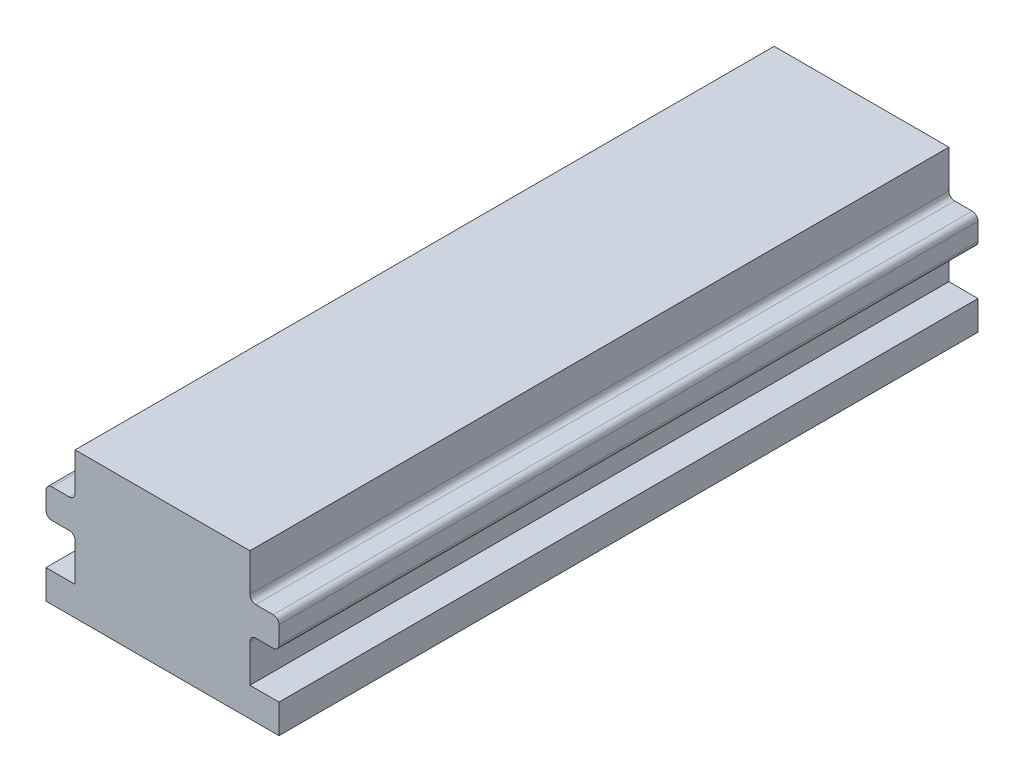
ISO-10303-21;
HEADER;
FILE_DESCRIPTION(('STEP AP214'),'2;1');
FILE_NAME('part.step','',(''),(''),'','','');
FILE_SCHEMA(('AUTOMOTIVE_DESIGN { 1 0 10303 214 1 1 1 1 }'));
ENDSEC;
DATA;
#1=APPLICATION_CONTEXT('core data for automotive mechanical design processes');
#2=APPLICATION_PROTOCOL_DEFINITION('international standard','automotive_design',2000,#1);
#3=PRODUCT_CONTEXT('',#1,'mechanical');
#4=PRODUCT('Part','Part','',(#3));
#5=PRODUCT_RELATED_PRODUCT_CATEGORY('part','',(#4));
#6=PRODUCT_DEFINITION_FORMATION('','',#4);
#7=PRODUCT_DEFINITION_CONTEXT('part definition',#1,'design');
#8=PRODUCT_DEFINITION('design','',#6,#7);
#9=PRODUCT_DEFINITION_SHAPE('','',#8);
#10=(LENGTH_UNIT() NAMED_UNIT(*) SI_UNIT(.MILLI.,.METRE.));
#11=(NAMED_UNIT(*) PLANE_ANGLE_UNIT() SI_UNIT($,.RADIAN.));
#12=(NAMED_UNIT(*) SI_UNIT($,.STERADIAN.) SOLID_ANGLE_UNIT());
#13=UNCERTAINTY_MEASURE_WITH_UNIT(LENGTH_MEASURE(1.E-05),#10,'distance_accuracy_value','');
#14=(GEOMETRIC_REPRESENTATION_CONTEXT(3) GLOBAL_UNCERTAINTY_ASSIGNED_CONTEXT((#13)) GLOBAL_UNIT_ASSIGNED_CONTEXT((#10,
#11,#12)) REPRESENTATION_CONTEXT('',''));
#15=CARTESIAN_POINT('',(0.,0.,0.));
#16=DIRECTION('',(0.,0.,1.));
#17=DIRECTION('',(1.,0.,0.));
#18=AXIS2_PLACEMENT_3D('',#15,#16,#17);
#19=CARTESIAN_POINT('',(0.,0.,152.4));
#20=DIRECTION('',(1.,0.,0.));
#21=DIRECTION('',(0.,0.,-1.));
#22=AXIS2_PLACEMENT_3D('',#19,#20,#21);
#23=PLANE('',#22);
#24=DIRECTION('',(0.,-1.,0.));
#25=VECTOR('',#24,1.);
#26=CARTESIAN_POINT('',(0.,0.,152.4));
#27=LINE('',#26,#25);
#28=CARTESIAN_POINT('',(0.,20.955,152.4));
#29=VERTEX_POINT('',#28);
#30=CARTESIAN_POINT('',(0.,17.145,152.4));
#31=VERTEX_POINT('',#30);
#32=EDGE_CURVE('E362',#29,#31,#27,.T.);
#33=ORIENTED_EDGE('',*,*,#32,.F.);
#34=DIRECTION('',(0.,0.,1.));
#35=VECTOR('',#34,1.);
#36=CARTESIAN_POINT('',(0.,20.955,0.));
#37=LINE('',#36,#35);
#38=CARTESIAN_POINT('',(0.,20.955,0.));
#39=VERTEX_POINT('',#38);
#40=EDGE_CURVE('E260',#39,#29,#37,.T.);
#41=ORIENTED_EDGE('',*,*,#40,.F.);
#42=DIRECTION('',(0.,-1.,0.));
#43=VECTOR('',#42,1.);
#44=CARTESIAN_POINT('',(0.,0.,0.));
#45=LINE('',#44,#43);
#46=CARTESIAN_POINT('',(0.,17.145,0.));
#47=VERTEX_POINT('',#46);
#48=EDGE_CURVE('E350',#39,#47,#45,.T.);
#49=ORIENTED_EDGE('',*,*,#48,.T.);
#50=DIRECTION('',(0.,0.,1.));
#51=VECTOR('',#50,1.);
#52=CARTESIAN_POINT('',(0.,17.145,0.));
#53=LINE('',#52,#51);
#54=EDGE_CURVE('E262',#47,#31,#53,.T.);
#55=ORIENTED_EDGE('',*,*,#54,.T.);
#56=EDGE_LOOP('',(#33,#41,#49,#55));
#57=FACE_BOUND('',#56,.T.);
#58=ADVANCED_FACE('F34',(#57),#23,.F.);
#59=CARTESIAN_POINT('',(50.8,0.,152.4));
#60=DIRECTION('',(-1.,0.,0.));
#61=DIRECTION('',(0.,0.,1.));
#62=AXIS2_PLACEMENT_3D('',#59,#60,#61);
#63=PLANE('',#62);
#64=DIRECTION('',(0.,1.,0.));
#65=VECTOR('',#64,1.);
#66=CARTESIAN_POINT('',(50.8,0.,0.));
#67=LINE('',#66,#65);
#68=CARTESIAN_POINT('',(50.8,0.,0.));
#69=VERTEX_POINT('',#68);
#70=CARTESIAN_POINT('',(50.8,6.35,0.));
#71=VERTEX_POINT('',#70);
#72=EDGE_CURVE('E354',#69,#71,#67,.T.);
#73=ORIENTED_EDGE('',*,*,#72,.T.);
#74=DIRECTION('',(0.,0.,1.));
#75=VECTOR('',#74,1.);
#76=CARTESIAN_POINT('',(50.8,6.35,152.4));
#77=LINE('',#76,#75);
#78=CARTESIAN_POINT('',(50.8,6.35,152.4));
#79=VERTEX_POINT('',#78);
#80=EDGE_CURVE('E345',#71,#79,#77,.T.);
#81=ORIENTED_EDGE('',*,*,#80,.T.);
#82=DIRECTION('',(0.,1.,0.));
#83=VECTOR('',#82,1.);
#84=CARTESIAN_POINT('',(50.8,0.,152.4));
#85=LINE('',#84,#83);
#86=CARTESIAN_POINT('',(50.8,0.,152.4));
#87=VERTEX_POINT('',#86);
#88=EDGE_CURVE('E366',#87,#79,#85,.T.);
#89=ORIENTED_EDGE('',*,*,#88,.F.);
#90=DIRECTION('',(0.,0.,-1.));
#91=VECTOR('',#90,1.);
#92=CARTESIAN_POINT('',(50.8,0.,152.4));
#93=LINE('',#92,#91);
#94=EDGE_CURVE('E371',#87,#69,#93,.T.);
#95=ORIENTED_EDGE('',*,*,#94,.T.);
#96=EDGE_LOOP('',(#73,#81,#89,#95));
#97=FACE_BOUND('',#96,.T.);
#98=ADVANCED_FACE('F431',(#97),#63,.F.);
#99=CARTESIAN_POINT('',(50.8,17.145,152.4));
#100=VERTEX_POINT('',#99);
#101=CARTESIAN_POINT('',(50.8,20.955,152.4));
#102=VERTEX_POINT('',#101);
#103=EDGE_CURVE('E365',#100,#102,#85,.T.);
#104=ORIENTED_EDGE('',*,*,#103,.F.);
#105=DIRECTION('',(0.,0.,1.));
#106=VECTOR('',#105,1.);
#107=CARTESIAN_POINT('',(50.8,17.145,0.));
#108=LINE('',#107,#106);
#109=CARTESIAN_POINT('',(50.8,17.145,0.));
#110=VERTEX_POINT('',#109);
#111=EDGE_CURVE('E332',#110,#100,#108,.T.);
#112=ORIENTED_EDGE('',*,*,#111,.F.);
#113=CARTESIAN_POINT('',(50.8,20.955,0.));
#114=VERTEX_POINT('',#113);
#115=EDGE_CURVE('E353',#110,#114,#67,.T.);
#116=ORIENTED_EDGE('',*,*,#115,.T.);
#117=DIRECTION('',(0.,0.,1.));
#118=VECTOR('',#117,1.);
#119=CARTESIAN_POINT('',(50.8,20.955,0.));
#120=LINE('',#119,#118);
#121=EDGE_CURVE('E334',#114,#102,#120,.T.);
#122=ORIENTED_EDGE('',*,*,#121,.T.);
#123=EDGE_LOOP('',(#104,#112,#116,#122));
#124=FACE_BOUND('',#123,.T.);
#125=ADVANCED_FACE('F409',(#124),#63,.F.);
#126=CARTESIAN_POINT('',(0.,6.35000000000004,152.4));
#127=VERTEX_POINT('',#126);
#128=CARTESIAN_POINT('',(0.,0.,152.4));
#129=VERTEX_POINT('',#128);
#130=EDGE_CURVE('E360',#127,#129,#27,.T.);
#131=ORIENTED_EDGE('',*,*,#130,.F.);
#132=DIRECTION('',(0.,0.,-1.));
#133=VECTOR('',#132,1.);
#134=CARTESIAN_POINT('',(0.,6.35000000000004,152.4));
#135=LINE('',#134,#133);
#136=CARTESIAN_POINT('',(0.,6.35000000000004,0.));
#137=VERTEX_POINT('',#136);
#138=EDGE_CURVE('E199',#127,#137,#135,.T.);
#139=ORIENTED_EDGE('',*,*,#138,.T.);
#140=CARTESIAN_POINT('',(0.,0.,0.));
#141=VERTEX_POINT('',#140);
#142=EDGE_CURVE('E348',#137,#141,#45,.T.);
#143=ORIENTED_EDGE('',*,*,#142,.T.);
#144=DIRECTION('',(0.,0.,-1.));
#145=VECTOR('',#144,1.);
#146=CARTESIAN_POINT('',(0.,0.,152.4));
#147=LINE('',#146,#145);
#148=EDGE_CURVE('E374',#129,#141,#147,.T.);
#149=ORIENTED_EDGE('',*,*,#148,.F.);
#150=EDGE_LOOP('',(#131,#139,#143,#149));
#151=FACE_BOUND('',#150,.T.);
#152=ADVANCED_FACE('F36',(#151),#23,.F.);
#153=CARTESIAN_POINT('',(0.,0.,152.4));
#154=DIRECTION('',(0.,1.,0.));
#155=DIRECTION('',(0.,0.,1.));
#156=AXIS2_PLACEMENT_3D('',#153,#154,#155);
#157=PLANE('',#156);
#158=DIRECTION('',(1.,0.,0.));
#159=VECTOR('',#158,1.);
#160=CARTESIAN_POINT('',(0.,0.,0.));
#161=LINE('',#160,#159);
#162=EDGE_CURVE('E351',#141,#69,#161,.T.);
#163=ORIENTED_EDGE('',*,*,#162,.T.);
#164=ORIENTED_EDGE('',*,*,#94,.F.);
#165=DIRECTION('',(1.,0.,0.));
#166=VECTOR('',#165,1.);
#167=CARTESIAN_POINT('',(0.,0.,152.4));
#168=LINE('',#167,#166);
#169=EDGE_CURVE('E363',#129,#87,#168,.T.);
#170=ORIENTED_EDGE('',*,*,#169,.F.);
#171=ORIENTED_EDGE('',*,*,#148,.T.);
#172=EDGE_LOOP('',(#163,#164,#170,#171));
#173=FACE_BOUND('',#172,.T.);
#174=ADVANCED_FACE('F436',(#173),#157,.F.);
#175=CARTESIAN_POINT('',(0.,31.75,152.4));
#176=DIRECTION('',(0.,-1.,0.));
#177=DIRECTION('',(0.,0.,-1.));
#178=AXIS2_PLACEMENT_3D('',#175,#176,#177);
#179=PLANE('',#178);
#180=DIRECTION('',(-1.,0.,0.));
#181=VECTOR('',#180,1.);
#182=CARTESIAN_POINT('',(0.,31.75,0.));
#183=LINE('',#182,#181);
#184=CARTESIAN_POINT('',(44.45,31.75,0.));
#185=VERTEX_POINT('',#184);
#186=CARTESIAN_POINT('',(6.35,31.75,0.));
#187=VERTEX_POINT('',#186);
#188=EDGE_CURVE('E357',#185,#187,#183,.T.);
#189=ORIENTED_EDGE('',*,*,#188,.T.);
#190=DIRECTION('',(0.,0.,1.));
#191=VECTOR('',#190,1.);
#192=CARTESIAN_POINT('',(6.35,31.75,152.4));
#193=LINE('',#192,#191);
#194=CARTESIAN_POINT('',(6.35,31.75,152.4));
#195=VERTEX_POINT('',#194);
#196=EDGE_CURVE('E271',#187,#195,#193,.T.);
#197=ORIENTED_EDGE('',*,*,#196,.T.);
#198=DIRECTION('',(-1.,0.,0.));
#199=VECTOR('',#198,1.);
#200=CARTESIAN_POINT('',(0.,31.75,152.4));
#201=LINE('',#200,#199);
#202=CARTESIAN_POINT('',(44.45,31.75,152.4));
#203=VERTEX_POINT('',#202);
#204=EDGE_CURVE('E369',#203,#195,#201,.T.);
#205=ORIENTED_EDGE('',*,*,#204,.F.);
#206=DIRECTION('',(0.,0.,-1.));
#207=VECTOR('',#206,1.);
#208=CARTESIAN_POINT('',(44.45,31.75,152.4));
#209=LINE('',#208,#207);
#210=EDGE_CURVE('E325',#203,#185,#209,.T.);
#211=ORIENTED_EDGE('',*,*,#210,.T.);
#212=EDGE_LOOP('',(#189,#197,#205,#211));
#213=FACE_BOUND('',#212,.T.);
#214=ADVANCED_FACE('F385',(#213),#179,.F.);
#215=CARTESIAN_POINT('',(0.,31.75,152.4));
#216=DIRECTION('',(0.,0.,-1.));
#217=DIRECTION('',(-1.,0.,0.));
#218=AXIS2_PLACEMENT_3D('',#215,#216,#217);
#219=PLANE('',#218);
#220=ORIENTED_EDGE('',*,*,#204,.T.);
#221=DIRECTION('',(0.,1.,0.));
#222=VECTOR('',#221,1.);
#223=CARTESIAN_POINT('',(6.35,38.1,152.4));
#224=LINE('',#223,#222);
#225=CARTESIAN_POINT('',(6.35,23.495,152.4));
#226=VERTEX_POINT('',#225);
#227=EDGE_CURVE('E233',#226,#195,#224,.T.);
#228=ORIENTED_EDGE('',*,*,#227,.F.);
#229=CARTESIAN_POINT('',(5.08,23.495,152.4));
#230=DIRECTION('',(0.,0.,1.));
#231=DIRECTION('',(-1.,0.,0.));
#232=AXIS2_PLACEMENT_3D('',#229,#230,#231);
#233=CIRCLE('',#232,1.27);
#234=CARTESIAN_POINT('',(5.07999999999999,22.225,152.4));
#235=VERTEX_POINT('',#234);
#236=EDGE_CURVE('E230',#235,#226,#233,.T.);
#237=ORIENTED_EDGE('',*,*,#236,.F.);
#238=DIRECTION('',(1.,0.,0.));
#239=VECTOR('',#238,1.);
#240=CARTESIAN_POINT('',(5.07999999999999,22.225,152.4));
#241=LINE('',#240,#239);
#242=CARTESIAN_POINT('',(1.27000000000001,22.225,152.4));
#243=VERTEX_POINT('',#242);
#244=EDGE_CURVE('E227',#243,#235,#241,.T.);
#245=ORIENTED_EDGE('',*,*,#244,.F.);
#246=CARTESIAN_POINT('',(1.27,20.955,152.4));
#247=DIRECTION('',(0.,0.,-1.));
#248=DIRECTION('',(1.,0.,0.));
#249=AXIS2_PLACEMENT_3D('',#246,#247,#248);
#250=CIRCLE('',#249,1.27);
#251=EDGE_CURVE('E224',#29,#243,#250,.T.);
#252=ORIENTED_EDGE('',*,*,#251,.F.);
#253=ORIENTED_EDGE('',*,*,#32,.T.);
#254=CARTESIAN_POINT('',(1.27,17.145,152.4));
#255=DIRECTION('',(0.,0.,-1.));
#256=DIRECTION('',(1.,0.,0.));
#257=AXIS2_PLACEMENT_3D('',#254,#255,#256);
#258=CIRCLE('',#257,1.27);
#259=CARTESIAN_POINT('',(1.27000000000001,15.875,152.4));
#260=VERTEX_POINT('',#259);
#261=EDGE_CURVE('E222',#260,#31,#258,.T.);
#262=ORIENTED_EDGE('',*,*,#261,.F.);
#263=DIRECTION('',(-1.,0.,0.));
#264=VECTOR('',#263,1.);
#265=CARTESIAN_POINT('',(5.07999999999999,15.875,152.4));
#266=LINE('',#265,#264);
#267=CARTESIAN_POINT('',(5.07999999999999,15.875,152.4));
#268=VERTEX_POINT('',#267);
#269=EDGE_CURVE('E217',#268,#260,#266,.T.);
#270=ORIENTED_EDGE('',*,*,#269,.F.);
#271=CARTESIAN_POINT('',(5.08,14.605,152.4));
#272=DIRECTION('',(0.,0.,1.));
#273=DIRECTION('',(-1.,0.,0.));
#274=AXIS2_PLACEMENT_3D('',#271,#272,#273);
#275=CIRCLE('',#274,1.27);
#276=CARTESIAN_POINT('',(6.35,14.605,152.4));
#277=VERTEX_POINT('',#276);
#278=EDGE_CURVE('E215',#277,#268,#275,.T.);
#279=ORIENTED_EDGE('',*,*,#278,.F.);
#280=DIRECTION('',(0.,1.,0.));
#281=VECTOR('',#280,1.);
#282=CARTESIAN_POINT('',(6.35,14.605,152.4));
#283=LINE('',#282,#281);
#284=CARTESIAN_POINT('',(6.35,6.35000000000004,152.4));
#285=VERTEX_POINT('',#284);
#286=EDGE_CURVE('E203',#285,#277,#283,.T.);
#287=ORIENTED_EDGE('',*,*,#286,.F.);
#288=DIRECTION('',(1.,0.,0.));
#289=VECTOR('',#288,1.);
#290=CARTESIAN_POINT('',(6.35,6.35000000000004,152.4));
#291=LINE('',#290,#289);
#292=EDGE_CURVE('E194',#127,#285,#291,.T.);
#293=ORIENTED_EDGE('',*,*,#292,.F.);
#294=ORIENTED_EDGE('',*,*,#130,.T.);
#295=ORIENTED_EDGE('',*,*,#169,.T.);
#296=ORIENTED_EDGE('',*,*,#88,.T.);
#297=DIRECTION('',(1.,0.,0.));
#298=VECTOR('',#297,1.);
#299=CARTESIAN_POINT('',(50.8,6.35,152.4));
#300=LINE('',#299,#298);
#301=CARTESIAN_POINT('',(44.45,6.35,152.4));
#302=VERTEX_POINT('',#301);
#303=EDGE_CURVE('E296',#302,#79,#300,.T.);
#304=ORIENTED_EDGE('',*,*,#303,.F.);
#305=DIRECTION('',(0.,-1.,0.));
#306=VECTOR('',#305,1.);
#307=CARTESIAN_POINT('',(44.45,14.605,152.4));
#308=LINE('',#307,#306);
#309=CARTESIAN_POINT('',(44.45,14.605,152.4));
#310=VERTEX_POINT('',#309);
#311=EDGE_CURVE('E293',#310,#302,#308,.T.);
#312=ORIENTED_EDGE('',*,*,#311,.F.);
#313=CARTESIAN_POINT('',(45.72,14.605,152.4));
#314=DIRECTION('',(0.,0.,1.));
#315=DIRECTION('',(-1.,0.,0.));
#316=AXIS2_PLACEMENT_3D('',#313,#314,#315);
#317=CIRCLE('',#316,1.27);
#318=CARTESIAN_POINT('',(45.72,15.875,152.4));
#319=VERTEX_POINT('',#318);
#320=EDGE_CURVE('E290',#319,#310,#317,.T.);
#321=ORIENTED_EDGE('',*,*,#320,.F.);
#322=DIRECTION('',(-1.,0.,0.));
#323=VECTOR('',#322,1.);
#324=CARTESIAN_POINT('',(49.53,15.875,152.4));
#325=LINE('',#324,#323);
#326=CARTESIAN_POINT('',(49.53,15.875,152.4));
#327=VERTEX_POINT('',#326);
#328=EDGE_CURVE('E287',#327,#319,#325,.T.);
#329=ORIENTED_EDGE('',*,*,#328,.F.);
#330=CARTESIAN_POINT('',(49.53,17.145,152.4));
#331=DIRECTION('',(0.,0.,-1.));
#332=DIRECTION('',(1.,0.,0.));
#333=AXIS2_PLACEMENT_3D('',#330,#331,#332);
#334=CIRCLE('',#333,1.27);
#335=EDGE_CURVE('E284',#100,#327,#334,.T.);
#336=ORIENTED_EDGE('',*,*,#335,.F.);
#337=ORIENTED_EDGE('',*,*,#103,.T.);
#338=CARTESIAN_POINT('',(49.53,20.955,152.4));
#339=DIRECTION('',(0.,0.,-1.));
#340=DIRECTION('',(1.,0.,0.));
#341=AXIS2_PLACEMENT_3D('',#338,#339,#340);
#342=CIRCLE('',#341,1.27);
#343=CARTESIAN_POINT('',(49.53,22.225,152.4));
#344=VERTEX_POINT('',#343);
#345=EDGE_CURVE('E282',#344,#102,#342,.T.);
#346=ORIENTED_EDGE('',*,*,#345,.F.);
#347=DIRECTION('',(1.,0.,0.));
#348=VECTOR('',#347,1.);
#349=CARTESIAN_POINT('',(49.53,22.225,152.4));
#350=LINE('',#349,#348);
#351=CARTESIAN_POINT('',(45.72,22.225,152.4));
#352=VERTEX_POINT('',#351);
#353=EDGE_CURVE('E279',#352,#344,#350,.T.);
#354=ORIENTED_EDGE('',*,*,#353,.F.);
#355=CARTESIAN_POINT('',(45.72,23.495,152.4));
#356=DIRECTION('',(0.,0.,1.));
#357=DIRECTION('',(-1.,0.,0.));
#358=AXIS2_PLACEMENT_3D('',#355,#356,#357);
#359=CIRCLE('',#358,1.27);
#360=CARTESIAN_POINT('',(44.45,23.495,152.4));
#361=VERTEX_POINT('',#360);
#362=EDGE_CURVE('E276',#361,#352,#359,.T.);
#363=ORIENTED_EDGE('',*,*,#362,.F.);
#364=DIRECTION('',(0.,-1.,0.));
#365=VECTOR('',#364,1.);
#366=CARTESIAN_POINT('',(44.45,36.83,152.4));
#367=LINE('',#366,#365);
#368=EDGE_CURVE('E274',#203,#361,#367,.T.);
#369=ORIENTED_EDGE('',*,*,#368,.F.);
#370=EDGE_LOOP('',(#220,#228,#237,#245,#252,#253,#262,#270,#279,#287,#293,#294,#295,#296,#304,
#312,#321,#329,#336,#337,#346,#354,#363,#369));
#371=FACE_BOUND('',#370,.T.);
#372=ADVANCED_FACE('F212',(#371),#219,.F.);
#373=CARTESIAN_POINT('',(0.,31.75,0.));
#374=DIRECTION('',(0.,0.,-1.));
#375=DIRECTION('',(-1.,0.,0.));
#376=AXIS2_PLACEMENT_3D('',#373,#374,#375);
#377=PLANE('',#376);
#378=DIRECTION('',(0.,1.,0.));
#379=VECTOR('',#378,1.);
#380=CARTESIAN_POINT('',(6.35,38.1,0.));
#381=LINE('',#380,#379);
#382=CARTESIAN_POINT('',(6.35,23.495,0.));
#383=VERTEX_POINT('',#382);
#384=EDGE_CURVE('E209',#383,#187,#381,.T.);
#385=ORIENTED_EDGE('',*,*,#384,.T.);
#386=ORIENTED_EDGE('',*,*,#188,.F.);
#387=DIRECTION('',(0.,1.,0.));
#388=VECTOR('',#387,1.);
#389=CARTESIAN_POINT('',(44.45,31.75,0.));
#390=LINE('',#389,#388);
#391=CARTESIAN_POINT('',(44.45,23.495,0.));
#392=VERTEX_POINT('',#391);
#393=EDGE_CURVE('E42',#392,#185,#390,.T.);
#394=ORIENTED_EDGE('',*,*,#393,.F.);
#395=CARTESIAN_POINT('',(45.72,23.495,0.));
#396=DIRECTION('',(0.,0.,1.));
#397=DIRECTION('',(-1.,0.,0.));
#398=AXIS2_PLACEMENT_3D('',#395,#396,#397);
#399=CIRCLE('',#398,1.27);
#400=CARTESIAN_POINT('',(45.72,22.225,0.));
#401=VERTEX_POINT('',#400);
#402=EDGE_CURVE('E301',#392,#401,#399,.T.);
#403=ORIENTED_EDGE('',*,*,#402,.T.);
#404=DIRECTION('',(1.,0.,0.));
#405=VECTOR('',#404,1.);
#406=CARTESIAN_POINT('',(49.53,22.225,0.));
#407=LINE('',#406,#405);
#408=CARTESIAN_POINT('',(49.53,22.225,0.));
#409=VERTEX_POINT('',#408);
#410=EDGE_CURVE('E304',#401,#409,#407,.T.);
#411=ORIENTED_EDGE('',*,*,#410,.T.);
#412=CARTESIAN_POINT('',(49.53,20.955,0.));
#413=DIRECTION('',(0.,0.,-1.));
#414=DIRECTION('',(1.,0.,0.));
#415=AXIS2_PLACEMENT_3D('',#412,#413,#414);
#416=CIRCLE('',#415,1.27);
#417=EDGE_CURVE('E307',#409,#114,#416,.T.);
#418=ORIENTED_EDGE('',*,*,#417,.T.);
#419=ORIENTED_EDGE('',*,*,#115,.F.);
#420=CARTESIAN_POINT('',(49.53,17.145,0.));
#421=DIRECTION('',(0.,0.,-1.));
#422=DIRECTION('',(1.,0.,0.));
#423=AXIS2_PLACEMENT_3D('',#420,#421,#422);
#424=CIRCLE('',#423,1.27);
#425=CARTESIAN_POINT('',(49.53,15.875,0.));
#426=VERTEX_POINT('',#425);
#427=EDGE_CURVE('E310',#110,#426,#424,.T.);
#428=ORIENTED_EDGE('',*,*,#427,.T.);
#429=DIRECTION('',(-1.,0.,0.));
#430=VECTOR('',#429,1.);
#431=CARTESIAN_POINT('',(49.53,15.875,0.));
#432=LINE('',#431,#430);
#433=CARTESIAN_POINT('',(45.72,15.875,0.));
#434=VERTEX_POINT('',#433);
#435=EDGE_CURVE('E313',#426,#434,#432,.T.);
#436=ORIENTED_EDGE('',*,*,#435,.T.);
#437=CARTESIAN_POINT('',(45.72,14.605,0.));
#438=DIRECTION('',(0.,0.,1.));
#439=DIRECTION('',(-1.,0.,0.));
#440=AXIS2_PLACEMENT_3D('',#437,#438,#439);
#441=CIRCLE('',#440,1.27);
#442=CARTESIAN_POINT('',(44.45,14.605,0.));
#443=VERTEX_POINT('',#442);
#444=EDGE_CURVE('E316',#434,#443,#441,.T.);
#445=ORIENTED_EDGE('',*,*,#444,.T.);
#446=DIRECTION('',(0.,-1.,0.));
#447=VECTOR('',#446,1.);
#448=CARTESIAN_POINT('',(44.45,14.605,0.));
#449=LINE('',#448,#447);
#450=CARTESIAN_POINT('',(44.45,6.35,0.));
#451=VERTEX_POINT('',#450);
#452=EDGE_CURVE('E319',#443,#451,#449,.T.);
#453=ORIENTED_EDGE('',*,*,#452,.T.);
#454=DIRECTION('',(1.,0.,0.));
#455=VECTOR('',#454,1.);
#456=CARTESIAN_POINT('',(54.61,6.34999999999998,0.));
#457=LINE('',#456,#455);
#458=EDGE_CURVE('E298',#451,#71,#457,.T.);
#459=ORIENTED_EDGE('',*,*,#458,.T.);
#460=ORIENTED_EDGE('',*,*,#72,.F.);
#461=ORIENTED_EDGE('',*,*,#162,.F.);
#462=ORIENTED_EDGE('',*,*,#142,.F.);
#463=DIRECTION('',(-1.,0.,0.));
#464=VECTOR('',#463,1.);
#465=CARTESIAN_POINT('',(0.,6.35000000000004,0.));
#466=LINE('',#465,#464);
#467=CARTESIAN_POINT('',(6.35,6.35000000000004,0.));
#468=VERTEX_POINT('',#467);
#469=EDGE_CURVE('E11',#468,#137,#466,.T.);
#470=ORIENTED_EDGE('',*,*,#469,.F.);
#471=DIRECTION('',(0.,1.,0.));
#472=VECTOR('',#471,1.);
#473=CARTESIAN_POINT('',(6.35,14.605,0.));
#474=LINE('',#473,#472);
#475=CARTESIAN_POINT('',(6.35,14.605,0.));
#476=VERTEX_POINT('',#475);
#477=EDGE_CURVE('E57',#468,#476,#474,.T.);
#478=ORIENTED_EDGE('',*,*,#477,.T.);
#479=CARTESIAN_POINT('',(5.08,14.605,0.));
#480=DIRECTION('',(0.,0.,1.));
#481=DIRECTION('',(-1.,0.,0.));
#482=AXIS2_PLACEMENT_3D('',#479,#480,#481);
#483=CIRCLE('',#482,1.27);
#484=CARTESIAN_POINT('',(5.07999999999999,15.875,0.));
#485=VERTEX_POINT('',#484);
#486=EDGE_CURVE('E236',#476,#485,#483,.T.);
#487=ORIENTED_EDGE('',*,*,#486,.T.);
#488=DIRECTION('',(-1.,0.,0.));
#489=VECTOR('',#488,1.);
#490=CARTESIAN_POINT('',(5.07999999999999,15.875,0.));
#491=LINE('',#490,#489);
#492=CARTESIAN_POINT('',(1.27000000000001,15.875,0.));
#493=VERTEX_POINT('',#492);
#494=EDGE_CURVE('E239',#485,#493,#491,.T.);
#495=ORIENTED_EDGE('',*,*,#494,.T.);
#496=CARTESIAN_POINT('',(1.27,17.145,0.));
#497=DIRECTION('',(0.,0.,-1.));
#498=DIRECTION('',(1.,0.,0.));
#499=AXIS2_PLACEMENT_3D('',#496,#497,#498);
#500=CIRCLE('',#499,1.27);
#501=EDGE_CURVE('E242',#493,#47,#500,.T.);
#502=ORIENTED_EDGE('',*,*,#501,.T.);
#503=ORIENTED_EDGE('',*,*,#48,.F.);
#504=CARTESIAN_POINT('',(1.27,20.955,0.));
#505=DIRECTION('',(0.,0.,-1.));
#506=DIRECTION('',(1.,0.,0.));
#507=AXIS2_PLACEMENT_3D('',#504,#505,#506);
#508=CIRCLE('',#507,1.27);
#509=CARTESIAN_POINT('',(1.27000000000001,22.225,0.));
#510=VERTEX_POINT('',#509);
#511=EDGE_CURVE('E245',#39,#510,#508,.T.);
#512=ORIENTED_EDGE('',*,*,#511,.T.);
#513=DIRECTION('',(1.,0.,0.));
#514=VECTOR('',#513,1.);
#515=CARTESIAN_POINT('',(5.07999999999999,22.225,0.));
#516=LINE('',#515,#514);
#517=CARTESIAN_POINT('',(5.07999999999999,22.225,0.));
#518=VERTEX_POINT('',#517);
#519=EDGE_CURVE('E49',#510,#518,#516,.T.);
#520=ORIENTED_EDGE('',*,*,#519,.T.);
#521=CARTESIAN_POINT('',(5.08,23.495,0.));
#522=DIRECTION('',(0.,0.,1.));
#523=DIRECTION('',(-1.,0.,0.));
#524=AXIS2_PLACEMENT_3D('',#521,#522,#523);
#525=CIRCLE('',#524,1.27);
#526=EDGE_CURVE('E249',#518,#383,#525,.T.);
#527=ORIENTED_EDGE('',*,*,#526,.T.);
#528=EDGE_LOOP('',(#385,#386,#394,#403,#411,#418,#419,#428,#436,#445,#453,#459,#460,#461,#462,
#470,#478,#487,#495,#502,#503,#512,#520,#527));
#529=FACE_BOUND('',#528,.T.);
#530=ADVANCED_FACE('F386',(#529),#377,.T.);
#531=CARTESIAN_POINT('',(44.45,36.83,0.));
#532=DIRECTION('',(-1.,0.,0.));
#533=DIRECTION('',(0.,0.,1.));
#534=AXIS2_PLACEMENT_3D('',#531,#532,#533);
#535=PLANE('',#534);
#536=ORIENTED_EDGE('',*,*,#368,.T.);
#537=DIRECTION('',(0.,0.,1.));
#538=VECTOR('',#537,1.);
#539=CARTESIAN_POINT('',(44.45,23.495,0.));
#540=LINE('',#539,#538);
#541=EDGE_CURVE('E322',#392,#361,#540,.T.);
#542=ORIENTED_EDGE('',*,*,#541,.F.);
#543=ORIENTED_EDGE('',*,*,#393,.T.);
#544=ORIENTED_EDGE('',*,*,#210,.F.);
#545=EDGE_LOOP('',(#536,#542,#543,#544));
#546=FACE_BOUND('',#545,.T.);
#547=ADVANCED_FACE('F379',(#546),#535,.F.);
#548=CARTESIAN_POINT('',(45.72,23.495,0.));
#549=DIRECTION('',(0.,0.,1.));
#550=DIRECTION('',(1.,0.,0.));
#551=AXIS2_PLACEMENT_3D('',#548,#549,#550);
#552=CYLINDRICAL_SURFACE('',#551,1.27);
#553=ORIENTED_EDGE('',*,*,#362,.T.);
#554=DIRECTION('',(0.,0.,1.));
#555=VECTOR('',#554,1.);
#556=CARTESIAN_POINT('',(45.72,22.225,0.));
#557=LINE('',#556,#555);
#558=EDGE_CURVE('E339',#401,#352,#557,.T.);
#559=ORIENTED_EDGE('',*,*,#558,.F.);
#560=ORIENTED_EDGE('',*,*,#402,.F.);
#561=ORIENTED_EDGE('',*,*,#541,.T.);
#562=EDGE_LOOP('',(#553,#559,#560,#561));
#563=FACE_BOUND('',#562,.T.);
#564=ADVANCED_FACE('F396',(#563),#552,.F.);
#565=CARTESIAN_POINT('',(49.53,22.225,0.));
#566=DIRECTION('',(0.,-1.,0.));
#567=DIRECTION('',(0.,0.,-1.));
#568=AXIS2_PLACEMENT_3D('',#565,#566,#567);
#569=PLANE('',#568);
#570=ORIENTED_EDGE('',*,*,#353,.T.);
#571=DIRECTION('',(0.,0.,1.));
#572=VECTOR('',#571,1.);
#573=CARTESIAN_POINT('',(49.53,22.225,0.));
#574=LINE('',#573,#572);
#575=EDGE_CURVE('E337',#409,#344,#574,.T.);
#576=ORIENTED_EDGE('',*,*,#575,.F.);
#577=ORIENTED_EDGE('',*,*,#410,.F.);
#578=ORIENTED_EDGE('',*,*,#558,.T.);
#579=EDGE_LOOP('',(#570,#576,#577,#578));
#580=FACE_BOUND('',#579,.T.);
#581=ADVANCED_FACE('F402',(#580),#569,.F.);
#582=CARTESIAN_POINT('',(49.53,20.955,0.));
#583=DIRECTION('',(0.,0.,1.));
#584=DIRECTION('',(1.,0.,0.));
#585=AXIS2_PLACEMENT_3D('',#582,#583,#584);
#586=CYLINDRICAL_SURFACE('',#585,1.27);
#587=ORIENTED_EDGE('',*,*,#345,.T.);
#588=ORIENTED_EDGE('',*,*,#121,.F.);
#589=ORIENTED_EDGE('',*,*,#417,.F.);
#590=ORIENTED_EDGE('',*,*,#575,.T.);
#591=EDGE_LOOP('',(#587,#588,#589,#590));
#592=FACE_BOUND('',#591,.T.);
#593=ADVANCED_FACE('F405',(#592),#586,.T.);
#594=CARTESIAN_POINT('',(50.8,6.35,0.));
#595=DIRECTION('',(0.,-1.,0.));
#596=DIRECTION('',(1.,0.,0.));
#597=AXIS2_PLACEMENT_3D('',#594,#595,#596);
#598=PLANE('',#597);
#599=ORIENTED_EDGE('',*,*,#458,.F.);
#600=DIRECTION('',(0.,0.,1.));
#601=VECTOR('',#600,1.);
#602=CARTESIAN_POINT('',(44.45,6.35,0.));
#603=LINE('',#602,#601);
#604=EDGE_CURVE('E323',#451,#302,#603,.T.);
#605=ORIENTED_EDGE('',*,*,#604,.T.);
#606=ORIENTED_EDGE('',*,*,#303,.T.);
#607=ORIENTED_EDGE('',*,*,#80,.F.);
#608=EDGE_LOOP('',(#599,#605,#606,#607));
#609=FACE_BOUND('',#608,.T.);
#610=ADVANCED_FACE('F441',(#609),#598,.F.);
#611=CARTESIAN_POINT('',(44.45,14.605,0.));
#612=DIRECTION('',(-1.,0.,0.));
#613=DIRECTION('',(0.,0.,1.));
#614=AXIS2_PLACEMENT_3D('',#611,#612,#613);
#615=PLANE('',#614);
#616=ORIENTED_EDGE('',*,*,#311,.T.);
#617=ORIENTED_EDGE('',*,*,#604,.F.);
#618=ORIENTED_EDGE('',*,*,#452,.F.);
#619=DIRECTION('',(0.,0.,1.));
#620=VECTOR('',#619,1.);
#621=CARTESIAN_POINT('',(44.45,14.605,0.));
#622=LINE('',#621,#620);
#623=EDGE_CURVE('E326',#443,#310,#622,.T.);
#624=ORIENTED_EDGE('',*,*,#623,.T.);
#625=EDGE_LOOP('',(#616,#617,#618,#624));
#626=FACE_BOUND('',#625,.T.);
#627=ADVANCED_FACE('F426',(#626),#615,.F.);
#628=CARTESIAN_POINT('',(45.72,14.605,0.));
#629=DIRECTION('',(0.,0.,1.));
#630=DIRECTION('',(1.,0.,0.));
#631=AXIS2_PLACEMENT_3D('',#628,#629,#630);
#632=CYLINDRICAL_SURFACE('',#631,1.27);
#633=ORIENTED_EDGE('',*,*,#320,.T.);
#634=ORIENTED_EDGE('',*,*,#623,.F.);
#635=ORIENTED_EDGE('',*,*,#444,.F.);
#636=DIRECTION('',(0.,0.,1.));
#637=VECTOR('',#636,1.);
#638=CARTESIAN_POINT('',(45.72,15.875,0.));
#639=LINE('',#638,#637);
#640=EDGE_CURVE('E328',#434,#319,#639,.T.);
#641=ORIENTED_EDGE('',*,*,#640,.T.);
#642=EDGE_LOOP('',(#633,#634,#635,#641));
#643=FACE_BOUND('',#642,.T.);
#644=ADVANCED_FACE('F421',(#643),#632,.F.);
#645=CARTESIAN_POINT('',(49.53,15.875,0.));
#646=DIRECTION('',(0.,1.,0.));
#647=DIRECTION('',(0.,0.,1.));
#648=AXIS2_PLACEMENT_3D('',#645,#646,#647);
#649=PLANE('',#648);
#650=ORIENTED_EDGE('',*,*,#328,.T.);
#651=ORIENTED_EDGE('',*,*,#640,.F.);
#652=ORIENTED_EDGE('',*,*,#435,.F.);
#653=DIRECTION('',(0.,0.,1.));
#654=VECTOR('',#653,1.);
#655=CARTESIAN_POINT('',(49.53,15.875,0.));
#656=LINE('',#655,#654);
#657=EDGE_CURVE('E330',#426,#327,#656,.T.);
#658=ORIENTED_EDGE('',*,*,#657,.T.);
#659=EDGE_LOOP('',(#650,#651,#652,#658));
#660=FACE_BOUND('',#659,.T.);
#661=ADVANCED_FACE('F419',(#660),#649,.F.);
#662=CARTESIAN_POINT('',(49.53,17.145,0.));
#663=DIRECTION('',(0.,0.,1.));
#664=DIRECTION('',(1.,0.,0.));
#665=AXIS2_PLACEMENT_3D('',#662,#663,#664);
#666=CYLINDRICAL_SURFACE('',#665,1.27);
#667=ORIENTED_EDGE('',*,*,#335,.T.);
#668=ORIENTED_EDGE('',*,*,#657,.F.);
#669=ORIENTED_EDGE('',*,*,#427,.F.);
#670=ORIENTED_EDGE('',*,*,#111,.T.);
#671=EDGE_LOOP('',(#667,#668,#669,#670));
#672=FACE_BOUND('',#671,.T.);
#673=ADVANCED_FACE('F416',(#672),#666,.T.);
#674=CARTESIAN_POINT('',(6.35,6.35000000000004,0.));
#675=DIRECTION('',(0.,-1.,0.));
#676=DIRECTION('',(1.,0.,0.));
#677=AXIS2_PLACEMENT_3D('',#674,#675,#676);
#678=PLANE('',#677);
#679=ORIENTED_EDGE('',*,*,#292,.T.);
#680=DIRECTION('',(0.,0.,1.));
#681=VECTOR('',#680,1.);
#682=CARTESIAN_POINT('',(6.35,6.35000000000004,0.));
#683=LINE('',#682,#681);
#684=EDGE_CURVE('E196',#468,#285,#683,.T.);
#685=ORIENTED_EDGE('',*,*,#684,.F.);
#686=ORIENTED_EDGE('',*,*,#469,.T.);
#687=ORIENTED_EDGE('',*,*,#138,.F.);
#688=EDGE_LOOP('',(#679,#685,#686,#687));
#689=FACE_BOUND('',#688,.T.);
#690=ADVANCED_FACE('F195',(#689),#678,.F.);
#691=CARTESIAN_POINT('',(6.35,14.605,0.));
#692=DIRECTION('',(1.,0.,0.));
#693=DIRECTION('',(0.,1.,0.));
#694=AXIS2_PLACEMENT_3D('',#691,#692,#693);
#695=PLANE('',#694);
#696=ORIENTED_EDGE('',*,*,#286,.T.);
#697=DIRECTION('',(0.,0.,1.));
#698=VECTOR('',#697,1.);
#699=CARTESIAN_POINT('',(6.35,14.605,0.));
#700=LINE('',#699,#698);
#701=EDGE_CURVE('E208',#476,#277,#700,.T.);
#702=ORIENTED_EDGE('',*,*,#701,.F.);
#703=ORIENTED_EDGE('',*,*,#477,.F.);
#704=ORIENTED_EDGE('',*,*,#684,.T.);
#705=EDGE_LOOP('',(#696,#702,#703,#704));
#706=FACE_BOUND('',#705,.T.);
#707=ADVANCED_FACE('F206',(#706),#695,.F.);
#708=CARTESIAN_POINT('',(5.08,14.605,0.));
#709=DIRECTION('',(0.,0.,1.));
#710=DIRECTION('',(1.,0.,0.));
#711=AXIS2_PLACEMENT_3D('',#708,#709,#710);
#712=CYLINDRICAL_SURFACE('',#711,1.27);
#713=ORIENTED_EDGE('',*,*,#278,.T.);
#714=DIRECTION('',(0.,0.,1.));
#715=VECTOR('',#714,1.);
#716=CARTESIAN_POINT('',(5.07999999999999,15.875,0.));
#717=LINE('',#716,#715);
#718=EDGE_CURVE('E267',#485,#268,#717,.T.);
#719=ORIENTED_EDGE('',*,*,#718,.F.);
#720=ORIENTED_EDGE('',*,*,#486,.F.);
#721=ORIENTED_EDGE('',*,*,#701,.T.);
#722=EDGE_LOOP('',(#713,#719,#720,#721));
#723=FACE_BOUND('',#722,.T.);
#724=ADVANCED_FACE('F506',(#723),#712,.F.);
#725=CARTESIAN_POINT('',(5.07999999999999,15.875,0.));
#726=DIRECTION('',(0.,1.,0.));
#727=DIRECTION('',(0.,0.,1.));
#728=AXIS2_PLACEMENT_3D('',#725,#726,#727);
#729=PLANE('',#728);
#730=ORIENTED_EDGE('',*,*,#269,.T.);
#731=DIRECTION('',(0.,0.,1.));
#732=VECTOR('',#731,1.);
#733=CARTESIAN_POINT('',(1.27000000000001,15.875,0.));
#734=LINE('',#733,#732);
#735=EDGE_CURVE('E265',#493,#260,#734,.T.);
#736=ORIENTED_EDGE('',*,*,#735,.F.);
#737=ORIENTED_EDGE('',*,*,#494,.F.);
#738=ORIENTED_EDGE('',*,*,#718,.T.);
#739=EDGE_LOOP('',(#730,#736,#737,#738));
#740=FACE_BOUND('',#739,.T.);
#741=ADVANCED_FACE('F513',(#740),#729,.F.);
#742=CARTESIAN_POINT('',(1.27,17.145,0.));
#743=DIRECTION('',(0.,0.,1.));
#744=DIRECTION('',(1.,0.,0.));
#745=AXIS2_PLACEMENT_3D('',#742,#743,#744);
#746=CYLINDRICAL_SURFACE('',#745,1.27);
#747=ORIENTED_EDGE('',*,*,#261,.T.);
#748=ORIENTED_EDGE('',*,*,#54,.F.);
#749=ORIENTED_EDGE('',*,*,#501,.F.);
#750=ORIENTED_EDGE('',*,*,#735,.T.);
#751=EDGE_LOOP('',(#747,#748,#749,#750));
#752=FACE_BOUND('',#751,.T.);
#753=ADVANCED_FACE('F521',(#752),#746,.T.);
#754=CARTESIAN_POINT('',(6.35,38.1,0.));
#755=DIRECTION('',(1.,0.,0.));
#756=DIRECTION('',(0.,1.,0.));
#757=AXIS2_PLACEMENT_3D('',#754,#755,#756);
#758=PLANE('',#757);
#759=ORIENTED_EDGE('',*,*,#384,.F.);
#760=DIRECTION('',(0.,0.,1.));
#761=VECTOR('',#760,1.);
#762=CARTESIAN_POINT('',(6.35,23.495,0.));
#763=LINE('',#762,#761);
#764=EDGE_CURVE('E254',#383,#226,#763,.T.);
#765=ORIENTED_EDGE('',*,*,#764,.T.);
#766=ORIENTED_EDGE('',*,*,#227,.T.);
#767=ORIENTED_EDGE('',*,*,#196,.F.);
#768=EDGE_LOOP('',(#759,#765,#766,#767));
#769=FACE_BOUND('',#768,.T.);
#770=ADVANCED_FACE('F390',(#769),#758,.F.);
#771=CARTESIAN_POINT('',(5.08,23.495,0.));
#772=DIRECTION('',(0.,0.,1.));
#773=DIRECTION('',(1.,0.,0.));
#774=AXIS2_PLACEMENT_3D('',#771,#772,#773);
#775=CYLINDRICAL_SURFACE('',#774,1.27);
#776=ORIENTED_EDGE('',*,*,#236,.T.);
#777=ORIENTED_EDGE('',*,*,#764,.F.);
#778=ORIENTED_EDGE('',*,*,#526,.F.);
#779=DIRECTION('',(0.,0.,1.));
#780=VECTOR('',#779,1.);
#781=CARTESIAN_POINT('',(5.07999999999999,22.225,0.));
#782=LINE('',#781,#780);
#783=EDGE_CURVE('E256',#518,#235,#782,.T.);
#784=ORIENTED_EDGE('',*,*,#783,.T.);
#785=EDGE_LOOP('',(#776,#777,#778,#784));
#786=FACE_BOUND('',#785,.T.);
#787=ADVANCED_FACE('F536',(#786),#775,.F.);
#788=CARTESIAN_POINT('',(5.07999999999999,22.225,0.));
#789=DIRECTION('',(0.,-1.,0.));
#790=DIRECTION('',(0.,0.,-1.));
#791=AXIS2_PLACEMENT_3D('',#788,#789,#790);
#792=PLANE('',#791);
#793=ORIENTED_EDGE('',*,*,#244,.T.);
#794=ORIENTED_EDGE('',*,*,#783,.F.);
#795=ORIENTED_EDGE('',*,*,#519,.F.);
#796=DIRECTION('',(0.,0.,1.));
#797=VECTOR('',#796,1.);
#798=CARTESIAN_POINT('',(1.27000000000001,22.225,0.));
#799=LINE('',#798,#797);
#800=EDGE_CURVE('E258',#510,#243,#799,.T.);
#801=ORIENTED_EDGE('',*,*,#800,.T.);
#802=EDGE_LOOP('',(#793,#794,#795,#801));
#803=FACE_BOUND('',#802,.T.);
#804=ADVANCED_FACE('F543',(#803),#792,.F.);
#805=CARTESIAN_POINT('',(1.27,20.955,0.));
#806=DIRECTION('',(0.,0.,1.));
#807=DIRECTION('',(1.,0.,0.));
#808=AXIS2_PLACEMENT_3D('',#805,#806,#807);
#809=CYLINDRICAL_SURFACE('',#808,1.27);
#810=ORIENTED_EDGE('',*,*,#251,.T.);
#811=ORIENTED_EDGE('',*,*,#800,.F.);
#812=ORIENTED_EDGE('',*,*,#511,.F.);
#813=ORIENTED_EDGE('',*,*,#40,.T.);
#814=EDGE_LOOP('',(#810,#811,#812,#813));
#815=FACE_BOUND('',#814,.T.);
#816=ADVANCED_FACE('F551',(#815),#809,.T.);
#817=CLOSED_SHELL('',(#58,#98,#125,#152,#174,#214,#372,#530,#547,#564,#581,#593,#610,#627,#644,
#661,#673,#690,#707,#724,#741,#753,#770,#787,#804,#816));
#818=MANIFOLD_SOLID_BREP('B2',#817);
#819=ADVANCED_BREP_SHAPE_REPRESENTATION('',(#18,#818),#14);
#820=SHAPE_DEFINITION_REPRESENTATION(#9,#819);
ENDSEC;
END-ISO-10303-21;
